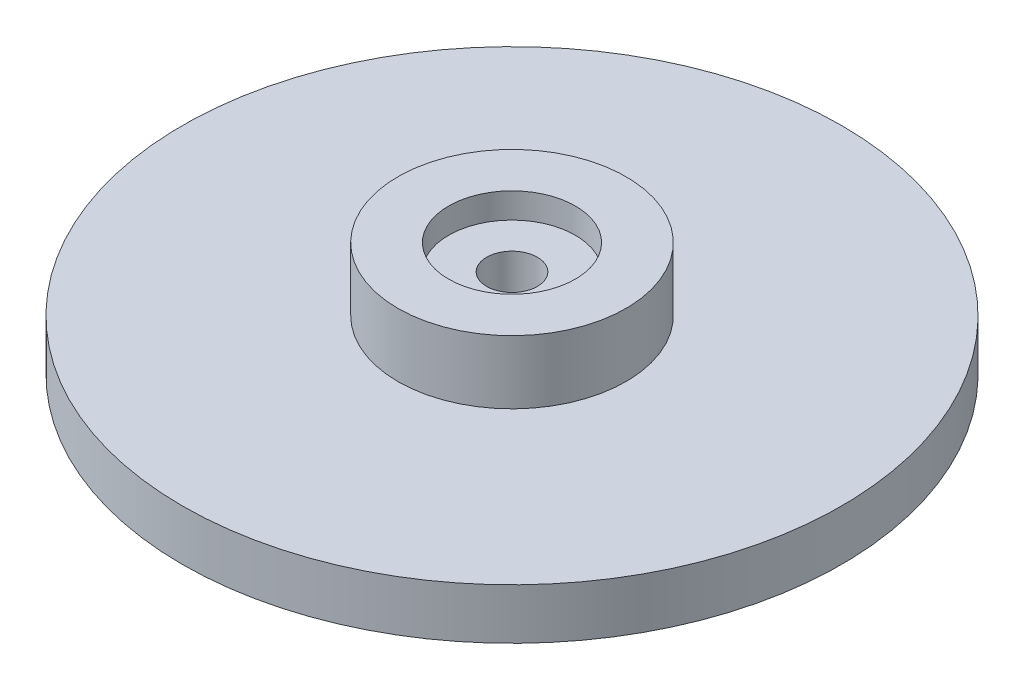
ISO-10303-21;
HEADER;
FILE_DESCRIPTION(('STEP AP214'),'2;1');
FILE_NAME('part.step','',(''),(''),'','','');
FILE_SCHEMA(('AUTOMOTIVE_DESIGN { 1 0 10303 214 1 1 1 1 }'));
ENDSEC;
DATA;
#1=APPLICATION_CONTEXT('core data for automotive mechanical design processes');
#2=APPLICATION_PROTOCOL_DEFINITION('international standard','automotive_design',2000,#1);
#3=PRODUCT_CONTEXT('',#1,'mechanical');
#4=PRODUCT('Part','Part','',(#3));
#5=PRODUCT_RELATED_PRODUCT_CATEGORY('part','',(#4));
#6=PRODUCT_DEFINITION_FORMATION('','',#4);
#7=PRODUCT_DEFINITION_CONTEXT('part definition',#1,'design');
#8=PRODUCT_DEFINITION('design','',#6,#7);
#9=PRODUCT_DEFINITION_SHAPE('','',#8);
#10=(LENGTH_UNIT() NAMED_UNIT(*) SI_UNIT(.MILLI.,.METRE.));
#11=(NAMED_UNIT(*) PLANE_ANGLE_UNIT() SI_UNIT($,.RADIAN.));
#12=(NAMED_UNIT(*) SI_UNIT($,.STERADIAN.) SOLID_ANGLE_UNIT());
#13=UNCERTAINTY_MEASURE_WITH_UNIT(LENGTH_MEASURE(1.E-05),#10,'distance_accuracy_value','');
#14=(GEOMETRIC_REPRESENTATION_CONTEXT(3) GLOBAL_UNCERTAINTY_ASSIGNED_CONTEXT((#13)) GLOBAL_UNIT_ASSIGNED_CONTEXT((#10,
#11,#12)) REPRESENTATION_CONTEXT('',''));
#15=CARTESIAN_POINT('',(0.,0.,0.));
#16=DIRECTION('',(0.,0.,1.));
#17=DIRECTION('',(1.,0.,0.));
#18=AXIS2_PLACEMENT_3D('',#15,#16,#17);
#19=CARTESIAN_POINT('',(0.,2.,0.));
#20=DIRECTION('',(0.,-1.,0.));
#21=DIRECTION('',(0.,0.,-1.));
#22=AXIS2_PLACEMENT_3D('',#19,#20,#21);
#23=CYLINDRICAL_SURFACE('',#22,13.);
#24=CARTESIAN_POINT('',(0.,2.,0.));
#25=DIRECTION('',(0.,1.,0.));
#26=DIRECTION('',(0.,0.,1.));
#27=AXIS2_PLACEMENT_3D('',#24,#25,#26);
#28=CIRCLE('',#27,13.);
#29=CARTESIAN_POINT('',(0.,2.,13.));
#30=VERTEX_POINT('',#29);
#31=EDGE_CURVE('E49',#30,#30,#28,.T.);
#32=ORIENTED_EDGE('',*,*,#31,.F.);
#33=EDGE_LOOP('',(#32));
#34=FACE_BOUND('',#33,.T.);
#35=CARTESIAN_POINT('',(0.,0.,0.));
#36=DIRECTION('',(0.,1.,0.));
#37=DIRECTION('',(0.,0.,1.));
#38=AXIS2_PLACEMENT_3D('',#35,#36,#37);
#39=CIRCLE('',#38,13.);
#40=CARTESIAN_POINT('',(0.,0.,13.));
#41=VERTEX_POINT('',#40);
#42=EDGE_CURVE('E54',#41,#41,#39,.T.);
#43=ORIENTED_EDGE('',*,*,#42,.T.);
#44=EDGE_LOOP('',(#43));
#45=FACE_BOUND('',#44,.T.);
#46=ADVANCED_FACE('F41',(#34,#45),#23,.T.);
#47=CARTESIAN_POINT('',(0.,2.,0.));
#48=DIRECTION('',(0.,1.,0.));
#49=DIRECTION('',(0.,0.,1.));
#50=AXIS2_PLACEMENT_3D('',#47,#48,#49);
#51=PLANE('',#50);
#52=CARTESIAN_POINT('',(0.,2.,0.));
#53=DIRECTION('',(0.,1.,0.));
#54=DIRECTION('',(0.,0.,1.));
#55=AXIS2_PLACEMENT_3D('',#52,#53,#54);
#56=CIRCLE('',#55,4.5);
#57=CARTESIAN_POINT('',(0.,2.,4.5));
#58=VERTEX_POINT('',#57);
#59=EDGE_CURVE('E61',#58,#58,#56,.T.);
#60=ORIENTED_EDGE('',*,*,#59,.F.);
#61=EDGE_LOOP('',(#60));
#62=FACE_BOUND('',#61,.T.);
#63=ORIENTED_EDGE('',*,*,#31,.T.);
#64=EDGE_LOOP('',(#63));
#65=FACE_BOUND('',#64,.T.);
#66=ADVANCED_FACE('F107',(#62,#65),#51,.T.);
#67=CARTESIAN_POINT('',(0.,0.,0.));
#68=DIRECTION('',(0.,1.,0.));
#69=DIRECTION('',(0.,0.,1.));
#70=AXIS2_PLACEMENT_3D('',#67,#68,#69);
#71=PLANE('',#70);
#72=CARTESIAN_POINT('',(0.,0.,0.));
#73=DIRECTION('',(0.,-1.,0.));
#74=DIRECTION('',(0.,0.,-1.));
#75=AXIS2_PLACEMENT_3D('',#72,#73,#74);
#76=CIRCLE('',#75,2.6);
#77=CARTESIAN_POINT('',(0.,0.,-2.6));
#78=VERTEX_POINT('',#77);
#79=EDGE_CURVE('E73',#78,#78,#76,.T.);
#80=ORIENTED_EDGE('',*,*,#79,.F.);
#81=EDGE_LOOP('',(#80));
#82=FACE_BOUND('',#81,.T.);
#83=ORIENTED_EDGE('',*,*,#42,.F.);
#84=EDGE_LOOP('',(#83));
#85=FACE_BOUND('',#84,.T.);
#86=ADVANCED_FACE('F112',(#82,#85),#71,.F.);
#87=CARTESIAN_POINT('',(0.,4.5,0.));
#88=DIRECTION('',(0.,1.,0.));
#89=DIRECTION('',(0.,0.,1.));
#90=AXIS2_PLACEMENT_3D('',#87,#88,#89);
#91=PLANE('',#90);
#92=CARTESIAN_POINT('',(0.,4.5,0.));
#93=DIRECTION('',(0.,1.,0.));
#94=DIRECTION('',(0.,0.,1.));
#95=AXIS2_PLACEMENT_3D('',#92,#93,#94);
#96=CIRCLE('',#95,4.5);
#97=CARTESIAN_POINT('',(0.,4.5,4.5));
#98=VERTEX_POINT('',#97);
#99=EDGE_CURVE('E59',#98,#98,#96,.T.);
#100=ORIENTED_EDGE('',*,*,#99,.T.);
#101=EDGE_LOOP('',(#100));
#102=FACE_BOUND('',#101,.T.);
#103=CARTESIAN_POINT('',(0.,4.5,0.));
#104=DIRECTION('',(0.,1.,0.));
#105=DIRECTION('',(0.,0.,1.));
#106=AXIS2_PLACEMENT_3D('',#103,#104,#105);
#107=CIRCLE('',#106,2.5);
#108=CARTESIAN_POINT('',(0.,4.5,2.5));
#109=VERTEX_POINT('',#108);
#110=EDGE_CURVE('E65',#109,#109,#107,.T.);
#111=ORIENTED_EDGE('',*,*,#110,.F.);
#112=EDGE_LOOP('',(#111));
#113=FACE_BOUND('',#112,.T.);
#114=ADVANCED_FACE('F120',(#102,#113),#91,.T.);
#115=CARTESIAN_POINT('',(0.,4.5,0.));
#116=DIRECTION('',(0.,-1.,0.));
#117=DIRECTION('',(0.,0.,-1.));
#118=AXIS2_PLACEMENT_3D('',#115,#116,#117);
#119=CYLINDRICAL_SURFACE('',#118,4.5);
#120=ORIENTED_EDGE('',*,*,#99,.F.);
#121=EDGE_LOOP('',(#120));
#122=FACE_BOUND('',#121,.T.);
#123=ORIENTED_EDGE('',*,*,#59,.T.);
#124=EDGE_LOOP('',(#123));
#125=FACE_BOUND('',#124,.T.);
#126=ADVANCED_FACE('F103',(#122,#125),#119,.T.);
#127=CARTESIAN_POINT('',(0.,4.5,0.));
#128=DIRECTION('',(0.,-1.,0.));
#129=DIRECTION('',(0.,0.,-1.));
#130=AXIS2_PLACEMENT_3D('',#127,#128,#129);
#131=CYLINDRICAL_SURFACE('',#130,2.5);
#132=CARTESIAN_POINT('',(0.,3.5,0.));
#133=DIRECTION('',(0.,1.,0.));
#134=DIRECTION('',(0.,0.,1.));
#135=AXIS2_PLACEMENT_3D('',#132,#133,#134);
#136=CIRCLE('',#135,2.5);
#137=CARTESIAN_POINT('',(0.,3.5,2.5));
#138=VERTEX_POINT('',#137);
#139=EDGE_CURVE('E10',#138,#138,#136,.T.);
#140=ORIENTED_EDGE('',*,*,#139,.F.);
#141=EDGE_LOOP('',(#140));
#142=FACE_BOUND('',#141,.T.);
#143=ORIENTED_EDGE('',*,*,#110,.T.);
#144=EDGE_LOOP('',(#143));
#145=FACE_BOUND('',#144,.T.);
#146=ADVANCED_FACE('F94',(#142,#145),#131,.F.);
#147=CARTESIAN_POINT('',(0.,3.5,0.));
#148=DIRECTION('',(0.,1.,0.));
#149=DIRECTION('',(0.,0.,1.));
#150=AXIS2_PLACEMENT_3D('',#147,#148,#149);
#151=PLANE('',#150);
#152=CARTESIAN_POINT('',(0.,3.5,0.));
#153=DIRECTION('',(0.,1.,0.));
#154=DIRECTION('',(0.,0.,1.));
#155=AXIS2_PLACEMENT_3D('',#152,#153,#154);
#156=CIRCLE('',#155,1.);
#157=CARTESIAN_POINT('',(0.,3.5,1.));
#158=VERTEX_POINT('',#157);
#159=EDGE_CURVE('E44',#158,#158,#156,.T.);
#160=ORIENTED_EDGE('',*,*,#159,.F.);
#161=EDGE_LOOP('',(#160));
#162=FACE_BOUND('',#161,.T.);
#163=ORIENTED_EDGE('',*,*,#139,.T.);
#164=EDGE_LOOP('',(#163));
#165=FACE_BOUND('',#164,.T.);
#166=ADVANCED_FACE('F91',(#162,#165),#151,.T.);
#167=CARTESIAN_POINT('',(0.,2.,0.));
#168=DIRECTION('',(0.,-1.,0.));
#169=DIRECTION('',(0.,0.,-1.));
#170=AXIS2_PLACEMENT_3D('',#167,#168,#169);
#171=CYLINDRICAL_SURFACE('',#170,2.6);
#172=CARTESIAN_POINT('',(0.,2.,0.));
#173=DIRECTION('',(0.,-1.,0.));
#174=DIRECTION('',(0.,0.,-1.));
#175=AXIS2_PLACEMENT_3D('',#172,#173,#174);
#176=CIRCLE('',#175,2.6);
#177=CARTESIAN_POINT('',(0.,2.,-2.6));
#178=VERTEX_POINT('',#177);
#179=EDGE_CURVE('E72',#178,#178,#176,.T.);
#180=ORIENTED_EDGE('',*,*,#179,.F.);
#181=EDGE_LOOP('',(#180));
#182=FACE_BOUND('',#181,.T.);
#183=ORIENTED_EDGE('',*,*,#79,.T.);
#184=EDGE_LOOP('',(#183));
#185=FACE_BOUND('',#184,.T.);
#186=ADVANCED_FACE('F93',(#182,#185),#171,.F.);
#187=CARTESIAN_POINT('',(0.,2.,0.));
#188=DIRECTION('',(0.,-1.,0.));
#189=DIRECTION('',(0.,0.,-1.));
#190=AXIS2_PLACEMENT_3D('',#187,#188,#189);
#191=PLANE('',#190);
#192=CARTESIAN_POINT('',(0.,2.,0.));
#193=DIRECTION('',(0.,-1.,0.));
#194=DIRECTION('',(0.,0.,-1.));
#195=AXIS2_PLACEMENT_3D('',#192,#193,#194);
#196=CIRCLE('',#195,1.);
#197=CARTESIAN_POINT('',(0.,2.,-1.));
#198=VERTEX_POINT('',#197);
#199=EDGE_CURVE('E80',#198,#198,#196,.T.);
#200=ORIENTED_EDGE('',*,*,#199,.F.);
#201=EDGE_LOOP('',(#200));
#202=FACE_BOUND('',#201,.T.);
#203=ORIENTED_EDGE('',*,*,#179,.T.);
#204=EDGE_LOOP('',(#203));
#205=FACE_BOUND('',#204,.T.);
#206=ADVANCED_FACE('F100',(#202,#205),#191,.T.);
#207=CARTESIAN_POINT('',(0.,4.,0.));
#208=DIRECTION('',(0.,-1.,0.));
#209=DIRECTION('',(0.,0.,-1.));
#210=AXIS2_PLACEMENT_3D('',#207,#208,#209);
#211=CYLINDRICAL_SURFACE('',#210,1.);
#212=ORIENTED_EDGE('',*,*,#159,.T.);
#213=EDGE_LOOP('',(#212));
#214=FACE_BOUND('',#213,.T.);
#215=ORIENTED_EDGE('',*,*,#199,.T.);
#216=EDGE_LOOP('',(#215));
#217=FACE_BOUND('',#216,.T.);
#218=ADVANCED_FACE('F89',(#214,#217),#211,.F.);
#219=CLOSED_SHELL('',(#46,#66,#86,#114,#126,#146,#166,#186,#206,#218));
#220=MANIFOLD_SOLID_BREP('B2',#219);
#221=ADVANCED_BREP_SHAPE_REPRESENTATION('',(#18,#220),#14);
#222=SHAPE_DEFINITION_REPRESENTATION(#9,#221);
ENDSEC;
END-ISO-10303-21;
